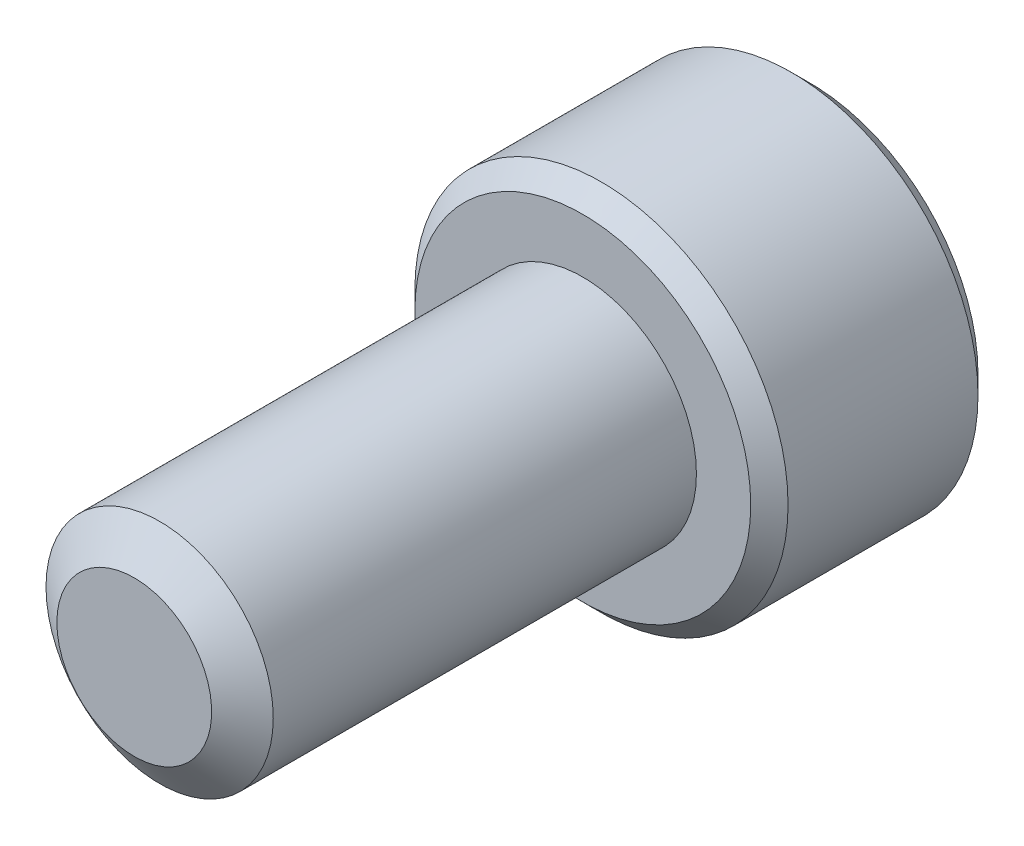
ISO-10303-21;
HEADER;
FILE_DESCRIPTION(('STEP AP214'),'2;1');
FILE_NAME('part.step','',(''),(''),'','','');
FILE_SCHEMA(('AUTOMOTIVE_DESIGN { 1 0 10303 214 1 1 1 1 }'));
ENDSEC;
DATA;
#1=APPLICATION_CONTEXT('core data for automotive mechanical design processes');
#2=APPLICATION_PROTOCOL_DEFINITION('international standard','automotive_design',2000,#1);
#3=PRODUCT_CONTEXT('',#1,'mechanical');
#4=PRODUCT('Part','Part','',(#3));
#5=PRODUCT_RELATED_PRODUCT_CATEGORY('part','',(#4));
#6=PRODUCT_DEFINITION_FORMATION('','',#4);
#7=PRODUCT_DEFINITION_CONTEXT('part definition',#1,'design');
#8=PRODUCT_DEFINITION('design','',#6,#7);
#9=PRODUCT_DEFINITION_SHAPE('','',#8);
#10=(LENGTH_UNIT() NAMED_UNIT(*) SI_UNIT(.MILLI.,.METRE.));
#11=(NAMED_UNIT(*) PLANE_ANGLE_UNIT() SI_UNIT($,.RADIAN.));
#12=(NAMED_UNIT(*) SI_UNIT($,.STERADIAN.) SOLID_ANGLE_UNIT());
#13=UNCERTAINTY_MEASURE_WITH_UNIT(LENGTH_MEASURE(1.E-05),#10,'distance_accuracy_value','');
#14=(GEOMETRIC_REPRESENTATION_CONTEXT(3) GLOBAL_UNCERTAINTY_ASSIGNED_CONTEXT((#13)) GLOBAL_UNIT_ASSIGNED_CONTEXT((#10,
#11,#12)) REPRESENTATION_CONTEXT('',''));
#15=CARTESIAN_POINT('',(0.,0.,0.));
#16=DIRECTION('',(0.,0.,1.));
#17=DIRECTION('',(1.,0.,0.));
#18=AXIS2_PLACEMENT_3D('',#15,#16,#17);
#19=CARTESIAN_POINT('',(0.,0.,-4.826));
#20=DIRECTION('',(0.,0.,1.));
#21=DIRECTION('',(1.,0.,0.));
#22=AXIS2_PLACEMENT_3D('',#19,#20,#21);
#23=PLANE('',#22);
#24=CARTESIAN_POINT('',(0.,0.,-4.826));
#25=DIRECTION('',(0.,0.,1.));
#26=DIRECTION('',(1.,0.,0.));
#27=AXIS2_PLACEMENT_3D('',#24,#25,#26);
#28=CIRCLE('',#27,3.56616);
#29=CARTESIAN_POINT('',(3.56616,0.,-4.826));
#30=VERTEX_POINT('',#29);
#31=EDGE_CURVE('E11',#30,#30,#28,.F.);
#32=ORIENTED_EDGE('',*,*,#31,.T.);
#33=EDGE_LOOP('',(#32));
#34=FACE_BOUND('',#33,.T.);
#35=CARTESIAN_POINT('',(0.,0.,-4.826));
#36=DIRECTION('',(0.,0.,-1.));
#37=DIRECTION('',(-1.,0.,0.));
#38=AXIS2_PLACEMENT_3D('',#35,#36,#37);
#39=CIRCLE('',#38,2.29135888084633);
#40=CARTESIAN_POINT('',(1.984375,1.14567944042316,-4.826));
#41=VERTEX_POINT('',#40);
#42=CARTESIAN_POINT('',(1.984375,-1.14567944042317,-4.826));
#43=VERTEX_POINT('',#42);
#44=EDGE_CURVE('E61',#41,#43,#39,.T.);
#45=ORIENTED_EDGE('',*,*,#44,.F.);
#46=CARTESIAN_POINT('',(0.,2.29135888084633,-4.826));
#47=VERTEX_POINT('',#46);
#48=EDGE_CURVE('E143',#47,#41,#39,.T.);
#49=ORIENTED_EDGE('',*,*,#48,.F.);
#50=CARTESIAN_POINT('',(-1.984375,1.14567944042317,-4.826));
#51=VERTEX_POINT('',#50);
#52=EDGE_CURVE('E138',#51,#47,#39,.T.);
#53=ORIENTED_EDGE('',*,*,#52,.F.);
#54=CARTESIAN_POINT('',(-1.984375,-1.14567944042317,-4.826));
#55=VERTEX_POINT('',#54);
#56=EDGE_CURVE('E102',#55,#51,#39,.T.);
#57=ORIENTED_EDGE('',*,*,#56,.F.);
#58=CARTESIAN_POINT('',(0.,-2.29135888084633,-4.826));
#59=VERTEX_POINT('',#58);
#60=EDGE_CURVE('E93',#59,#55,#39,.T.);
#61=ORIENTED_EDGE('',*,*,#60,.F.);
#62=EDGE_CURVE('E54',#43,#59,#39,.T.);
#63=ORIENTED_EDGE('',*,*,#62,.F.);
#64=EDGE_LOOP('',(#45,#49,#53,#57,#61,#63));
#65=FACE_BOUND('',#64,.T.);
#66=ADVANCED_FACE('F39',(#34,#65),#23,.F.);
#67=CARTESIAN_POINT('',(0.,0.,9.525));
#68=DIRECTION('',(0.,0.,-1.));
#69=DIRECTION('',(-1.,0.,0.));
#70=AXIS2_PLACEMENT_3D('',#67,#68,#69);
#71=CYLINDRICAL_SURFACE('',#70,2.413);
#72=CARTESIAN_POINT('',(0.,0.,8.98615127117986));
#73=DIRECTION('',(0.,0.,-1.));
#74=DIRECTION('',(-1.,0.,0.));
#75=AXIS2_PLACEMENT_3D('',#72,#73,#74);
#76=CIRCLE('',#75,2.413);
#77=CARTESIAN_POINT('',(-2.413,0.,8.98615127117986));
#78=VERTEX_POINT('',#77);
#79=EDGE_CURVE('E185',#78,#78,#76,.T.);
#80=CARTESIAN_POINT('',(0.,0.,0.));
#81=DIRECTION('',(0.,0.,1.));
#82=DIRECTION('',(1.,0.,0.));
#83=AXIS2_PLACEMENT_3D('',#80,#81,#82);
#84=CIRCLE('',#83,2.413);
#85=CARTESIAN_POINT('',(-2.413,0.,0.));
#86=VERTEX_POINT('',#85);
#87=EDGE_CURVE('E184',#86,#86,#84,.T.);
#88=CARTESIAN_POINT('',(-2.413,0.,8.98615127117986));
#89=CARTESIAN_POINT('',(-2.413,0.,8.89254552877173));
#90=CARTESIAN_POINT('',(-2.413,0.,8.79893978636361));
#91=CARTESIAN_POINT('',(-2.413,0.,8.61172830154736));
#92=CARTESIAN_POINT('',(-2.413,0.,8.51812255913924));
#93=CARTESIAN_POINT('',(-2.413,0.,8.33091107432299));
#94=CARTESIAN_POINT('',(-2.413,0.,8.23730533191487));
#95=CARTESIAN_POINT('',(-2.413,0.,8.05009384709862));
#96=CARTESIAN_POINT('',(-2.413,0.,7.9564881046905));
#97=CARTESIAN_POINT('',(-2.413,0.,7.76927661987425));
#98=CARTESIAN_POINT('',(-2.413,0.,7.67567087746613));
#99=CARTESIAN_POINT('',(-2.413,0.,7.48845939264988));
#100=CARTESIAN_POINT('',(-2.413,0.,7.39485365024176));
#101=CARTESIAN_POINT('',(-2.413,0.,7.20764216542551));
#102=CARTESIAN_POINT('',(-2.413,0.,7.11403642301739));
#103=CARTESIAN_POINT('',(-2.413,0.,6.92682493820114));
#104=CARTESIAN_POINT('',(-2.413,0.,6.83321919579302));
#105=CARTESIAN_POINT('',(-2.413,0.,6.64600771097677));
#106=CARTESIAN_POINT('',(-2.413,0.,6.55240196856865));
#107=CARTESIAN_POINT('',(-2.413,0.,6.3651904837524));
#108=CARTESIAN_POINT('',(-2.413,0.,6.27158474134428));
#109=CARTESIAN_POINT('',(-2.413,0.,6.08437325652803));
#110=CARTESIAN_POINT('',(-2.413,0.,5.9907675141199));
#111=CARTESIAN_POINT('',(-2.413,0.,5.80355602930366));
#112=CARTESIAN_POINT('',(-2.413,0.,5.70995028689553));
#113=CARTESIAN_POINT('',(-2.413,0.,5.52273880207929));
#114=CARTESIAN_POINT('',(-2.413,0.,5.42913305967117));
#115=CARTESIAN_POINT('',(-2.413,0.,5.24192157485492));
#116=CARTESIAN_POINT('',(-2.413,0.,5.14831583244679));
#117=CARTESIAN_POINT('',(-2.413,0.,4.96110434763055));
#118=CARTESIAN_POINT('',(-2.413,0.,4.86749860522242));
#119=CARTESIAN_POINT('',(-2.413,0.,4.68028712040618));
#120=CARTESIAN_POINT('',(-2.413,0.,4.58668137799805));
#121=CARTESIAN_POINT('',(-2.413,0.,4.3994698931818));
#122=CARTESIAN_POINT('',(-2.413,0.,4.30586415077368));
#123=CARTESIAN_POINT('',(-2.413,0.,4.11865266595743));
#124=CARTESIAN_POINT('',(-2.413,0.,4.02504692354931));
#125=CARTESIAN_POINT('',(-2.413,0.,3.83783543873306));
#126=CARTESIAN_POINT('',(-2.413,0.,3.74422969632494));
#127=CARTESIAN_POINT('',(-2.413,0.,3.55701821150869));
#128=CARTESIAN_POINT('',(-2.413,0.,3.46341246910057));
#129=CARTESIAN_POINT('',(-2.413,0.,3.27620098428432));
#130=CARTESIAN_POINT('',(-2.413,0.,3.1825952418762));
#131=CARTESIAN_POINT('',(-2.413,0.,2.99538375705995));
#132=CARTESIAN_POINT('',(-2.413,0.,2.90177801465183));
#133=CARTESIAN_POINT('',(-2.413,0.,2.71456652983558));
#134=CARTESIAN_POINT('',(-2.413,0.,2.62096078742746));
#135=CARTESIAN_POINT('',(-2.413,0.,2.43374930261121));
#136=CARTESIAN_POINT('',(-2.413,0.,2.34014356020309));
#137=CARTESIAN_POINT('',(-2.413,0.,2.15293207538684));
#138=CARTESIAN_POINT('',(-2.413,0.,2.05932633297872));
#139=CARTESIAN_POINT('',(-2.413,0.,1.87211484816247));
#140=CARTESIAN_POINT('',(-2.413,0.,1.77850910575435));
#141=CARTESIAN_POINT('',(-2.413,0.,1.5912976209381));
#142=CARTESIAN_POINT('',(-2.413,0.,1.49769187852998));
#143=CARTESIAN_POINT('',(-2.413,0.,1.31048039371373));
#144=CARTESIAN_POINT('',(-2.413,0.,1.21687465130561));
#145=CARTESIAN_POINT('',(-2.413,0.,1.02966316648936));
#146=CARTESIAN_POINT('',(-2.413,0.,0.936057424081235));
#147=CARTESIAN_POINT('',(-2.413,0.,0.748845939264988));
#148=CARTESIAN_POINT('',(-2.413,0.,0.655240196856864));
#149=CARTESIAN_POINT('',(-2.413,0.,0.468028712040617));
#150=CARTESIAN_POINT('',(-2.413,0.,0.374422969632494));
#151=CARTESIAN_POINT('',(-2.413,0.,0.187211484816247));
#152=CARTESIAN_POINT('',(-2.413,0.,0.0936057424081236));
#153=CARTESIAN_POINT('',(-2.413,0.,0.));
#154=B_SPLINE_CURVE_WITH_KNOTS('',3,(#88,#89,#90,#91,#92,#93,#94,#95,#96,#97,#98,#99,#100,#101,
#102,#103,#104,#105,#106,#107,#108,#109,#110,#111,#112,#113,#114,#115,#116,#117,#118,#119,#120,
#121,#122,#123,#124,#125,#126,#127,#128,#129,#130,#131,#132,#133,#134,#135,#136,#137,#138,#139,
#140,#141,#142,#143,#144,#145,#146,#147,#148,#149,#150,#151,#152,#153),.UNSPECIFIED.,.F.,.F.,(4,
2,2,2,2,2,2,2,2,2,2,2,2,2,2,2,2,2,2,2,2,2,2,2,2,2,2,2,2,2,2,2,4),(0.,0.280817227224372,
0.561634454448743,0.842451681673113,1.12326890889748,1.40408613612185,1.68490336334622,
1.96572059057059,2.24653781779497,2.52735504501934,2.80817227224371,3.08898949946808,
3.36980672669245,3.65062395391682,3.93144118114119,4.21225840836556,4.49307563558993,
4.7738928628143,5.05471009003867,5.33552731726304,5.61634454448741,5.89716177171178,
6.17797899893615,6.45879622616053,6.7396134533849,7.02043068060927,7.30124790783364,
7.58206513505801,7.86288236228238,8.14369958950675,8.42451681673112,8.70533404395549,
8.98615127117986),.UNSPECIFIED.);
#155=EDGE_CURVE('BSEAM255',#78,#86,#154,.T.);
#156=ORIENTED_EDGE('',*,*,#79,.T.);
#157=ORIENTED_EDGE('',*,*,#87,.T.);
#158=ORIENTED_EDGE('',*,*,#155,.T.);
#159=ORIENTED_EDGE('',*,*,#155,.F.);
#160=EDGE_LOOP('',(#156,#158,#157,#159));
#161=FACE_BOUND('',#160,.T.);
#162=ADVANCED_FACE('F255',(#161),#71,.T.);
#163=CARTESIAN_POINT('',(0.,0.,9.52500000000001));
#164=DIRECTION('',(0.,0.,-1.));
#165=DIRECTION('',(-1.,0.,0.));
#166=AXIS2_PLACEMENT_3D('',#163,#164,#165);
#167=CONICAL_SURFACE('',#166,1.643444262,0.959931088596871);
#168=ORIENTED_EDGE('',*,*,#79,.F.);
#169=EDGE_LOOP('',(#168));
#170=FACE_BOUND('',#169,.T.);
#171=CARTESIAN_POINT('',(0.,0.,9.52500000000001));
#172=DIRECTION('',(0.,0.,-1.));
#173=DIRECTION('',(-1.,0.,0.));
#174=AXIS2_PLACEMENT_3D('',#171,#172,#173);
#175=CIRCLE('',#174,1.643444262);
#176=CARTESIAN_POINT('',(-1.643444262,0.,9.52500000000001));
#177=VERTEX_POINT('',#176);
#178=EDGE_CURVE('E115',#177,#177,#175,.T.);
#179=ORIENTED_EDGE('',*,*,#178,.T.);
#180=EDGE_LOOP('',(#179));
#181=FACE_BOUND('',#180,.T.);
#182=ADVANCED_FACE('F265',(#170,#181),#167,.T.);
#183=CARTESIAN_POINT('',(0.,0.,9.525));
#184=DIRECTION('',(0.,0.,1.));
#185=DIRECTION('',(1.,0.,0.));
#186=AXIS2_PLACEMENT_3D('',#183,#184,#185);
#187=PLANE('',#186);
#188=ORIENTED_EDGE('',*,*,#178,.F.);
#189=EDGE_LOOP('',(#188));
#190=FACE_BOUND('',#189,.T.);
#191=ADVANCED_FACE('F263',(#190),#187,.T.);
#192=CARTESIAN_POINT('',(0.,0.,-4.826));
#193=DIRECTION('',(0.,0.,1.));
#194=DIRECTION('',(1.,0.,0.));
#195=AXIS2_PLACEMENT_3D('',#192,#193,#194);
#196=CYLINDRICAL_SURFACE('',#195,3.9624);
#197=CARTESIAN_POINT('',(0.,0.,-0.396240000000001));
#198=DIRECTION('',(0.,0.,1.));
#199=DIRECTION('',(1.,0.,0.));
#200=AXIS2_PLACEMENT_3D('',#197,#198,#199);
#201=CIRCLE('',#200,3.9624);
#202=CARTESIAN_POINT('',(3.9624,0.,-0.396240000000001));
#203=VERTEX_POINT('',#202);
#204=EDGE_CURVE('E48',#203,#203,#201,.F.);
#205=ORIENTED_EDGE('',*,*,#204,.T.);
#206=EDGE_LOOP('',(#205));
#207=FACE_BOUND('',#206,.T.);
#208=CARTESIAN_POINT('',(0.,0.,-4.42976));
#209=DIRECTION('',(0.,0.,1.));
#210=DIRECTION('',(1.,0.,0.));
#211=AXIS2_PLACEMENT_3D('',#208,#209,#210);
#212=CIRCLE('',#211,3.9624);
#213=CARTESIAN_POINT('',(3.9624,0.,-4.42976));
#214=VERTEX_POINT('',#213);
#215=EDGE_CURVE('E286',#214,#214,#212,.T.);
#216=ORIENTED_EDGE('',*,*,#215,.T.);
#217=EDGE_LOOP('',(#216));
#218=FACE_BOUND('',#217,.T.);
#219=ADVANCED_FACE('F259',(#207,#218),#196,.T.);
#220=CARTESIAN_POINT('',(0.,0.,0.));
#221=DIRECTION('',(0.,0.,1.));
#222=DIRECTION('',(1.,0.,0.));
#223=AXIS2_PLACEMENT_3D('',#220,#221,#222);
#224=PLANE('',#223);
#225=CARTESIAN_POINT('',(0.,0.,0.));
#226=DIRECTION('',(0.,0.,1.));
#227=DIRECTION('',(1.,0.,0.));
#228=AXIS2_PLACEMENT_3D('',#225,#226,#227);
#229=CIRCLE('',#228,3.56616);
#230=CARTESIAN_POINT('',(3.56616,0.,0.));
#231=VERTEX_POINT('',#230);
#232=EDGE_CURVE('E114',#231,#231,#229,.T.);
#233=ORIENTED_EDGE('',*,*,#232,.T.);
#234=EDGE_LOOP('',(#233));
#235=FACE_BOUND('',#234,.T.);
#236=ORIENTED_EDGE('',*,*,#87,.F.);
#237=EDGE_LOOP('',(#236));
#238=FACE_BOUND('',#237,.T.);
#239=ADVANCED_FACE('F208',(#235,#238),#224,.T.);
#240=CARTESIAN_POINT('',(0.,0.,-4.826));
#241=DIRECTION('',(0.,0.,-1.));
#242=DIRECTION('',(-1.,0.,0.));
#243=AXIS2_PLACEMENT_3D('',#240,#241,#242);
#244=CONICAL_SURFACE('',#243,2.29135888084633,0.78539816339745);
#245=CARTESIAN_POINT('',(-1.984375,4.38635024598007,-7.34897519782274));
#246=CARTESIAN_POINT('',(-1.984375,4.25778236916222,-7.23187255043514));
#247=CARTESIAN_POINT('',(-1.984375,4.12880938963501,-7.1152075711675));
#248=CARTESIAN_POINT('',(-1.984375,3.8697150482739,-6.88309307113962));
#249=CARTESIAN_POINT('',(-1.984375,3.73959339744263,-6.76764387326629));
#250=CARTESIAN_POINT('',(-1.984375,3.47693738702936,-6.53749248847528));
#251=CARTESIAN_POINT('',(-1.984375,3.3443922128216,-6.42280261206569));
#252=CARTESIAN_POINT('',(-1.984375,3.07740414215957,-6.19568123842686));
#253=CARTESIAN_POINT('',(-1.984375,2.94296150861167,-6.08324943345639));
#254=CARTESIAN_POINT('',(-1.984375,2.69093433000247,-5.87745000368473));
#255=CARTESIAN_POINT('',(-1.984375,2.57369587574335,-5.78365991859573));
#256=CARTESIAN_POINT('',(-1.984375,2.33669402095219,-5.59933006518558));
#257=CARTESIAN_POINT('',(-1.984375,2.21693090511933,-5.5087899334554));
#258=CARTESIAN_POINT('',(-1.984375,1.97414978626332,-5.33250529335592));
#259=CARTESIAN_POINT('',(-1.984375,1.8511363783479,-5.24675449786087));
#260=CARTESIAN_POINT('',(-1.984375,1.60051911268812,-5.08227129509849));
#261=CARTESIAN_POINT('',(-1.984375,1.47291846186661,-5.00353411359307));
#262=CARTESIAN_POINT('',(-1.984375,1.2789090002779,-4.89486132815752));
#263=CARTESIAN_POINT('',(-1.984375,1.21488472401634,-4.86070149112759));
#264=CARTESIAN_POINT('',(-1.984375,1.08519642932975,-4.79566586392286));
#265=CARTESIAN_POINT('',(-1.984375,1.01953210237452,-4.76479069750205));
#266=CARTESIAN_POINT('',(-1.984375,0.81999148678731,-4.67842375900681));
#267=CARTESIAN_POINT('',(-1.984375,0.683245753728957,-4.62900101211804));
#268=CARTESIAN_POINT('',(-1.984375,0.48625684861587,-4.5769842359019));
#269=CARTESIAN_POINT('',(-1.984375,0.428714400653208,-4.56399752017917));
#270=CARTESIAN_POINT('',(-1.984375,0.312779003368322,-4.5427082809321));
#271=CARTESIAN_POINT('',(-1.984375,0.254386491647091,-4.53440342902996));
#272=CARTESIAN_POINT('',(-1.984375,0.137202439336304,-4.52290067704976));
#273=CARTESIAN_POINT('',(-1.984375,0.0784118196893296,-4.51969349911655));
#274=CARTESIAN_POINT('',(-1.984375,-0.0392233767990006,-4.51853221278239));
#275=CARTESIAN_POINT('',(-1.984375,-0.0980679542441397,-4.52057816389864));
#276=CARTESIAN_POINT('',(-1.984375,-0.21520013647359,-4.52979857799852));
#277=CARTESIAN_POINT('',(-1.984375,-0.273488761914176,-4.53696028481731));
#278=CARTESIAN_POINT('',(-1.984375,-0.389286265316371,-4.55603259141478));
#279=CARTESIAN_POINT('',(-1.984375,-0.446794960098088,-4.567944287499));
#280=CARTESIAN_POINT('',(-1.984375,-0.56091102362673,-4.59602327187489));
#281=CARTESIAN_POINT('',(-1.984375,-0.61751563591901,-4.61220162881068));
#282=CARTESIAN_POINT('',(-1.984375,-0.729535693290378,-4.64820502249007));
#283=CARTESIAN_POINT('',(-1.984375,-0.784951198991555,-4.66802987283546));
#284=CARTESIAN_POINT('',(-1.984375,-0.914325334864688,-4.7184487048077));
#285=CARTESIAN_POINT('',(-1.984375,-0.987772757857292,-4.7503494712672));
#286=CARTESIAN_POINT('',(-1.984375,-1.13259042621503,-4.81859015311983));
#287=CARTESIAN_POINT('',(-1.984375,-1.20395954857947,-4.85493241529602));
#288=CARTESIAN_POINT('',(-1.984375,-1.34496189830389,-4.93112595582489));
#289=CARTESIAN_POINT('',(-1.984375,-1.41459154292871,-4.97098381524999));
#290=CARTESIAN_POINT('',(-1.984375,-1.55223895461487,-5.05340283838906));
#291=CARTESIAN_POINT('',(-1.984375,-1.62025639194186,-5.09596454866417));
#292=CARTESIAN_POINT('',(-1.984375,-1.823662914216,-5.22772004019455));
#293=CARTESIAN_POINT('',(-1.984375,-1.95694317622707,-5.32016210087376));
#294=CARTESIAN_POINT('',(-1.984375,-2.21933064334271,-5.51039077948145));
#295=CARTESIAN_POINT('',(-1.984375,-2.34844239081737,-5.60817124432184));
#296=CARTESIAN_POINT('',(-1.984375,-2.64424712607428,-5.83898376478607));
#297=CARTESIAN_POINT('',(-1.984375,-2.80988215135694,-5.97336658258107));
#298=CARTESIAN_POINT('',(-1.984375,-3.13786393939787,-6.24620657210738));
#299=CARTESIAN_POINT('',(-1.984375,-3.30020907072943,-6.38466568561171));
#300=CARTESIAN_POINT('',(-1.984375,-3.61743160532523,-6.65987341299285));
#301=CARTESIAN_POINT('',(-1.984375,-3.77238267778691,-6.79653731694909));
#302=CARTESIAN_POINT('',(-1.984375,-4.00353093931969,-7.00284090592041));
#303=CARTESIAN_POINT('',(-1.984375,-4.08033809401079,-7.0718000308107));
#304=CARTESIAN_POINT('',(-1.984375,-4.23359721811938,-7.21010924523581));
#305=CARTESIAN_POINT('',(-1.984375,-4.31004919377067,-7.27945932786121));
#306=CARTESIAN_POINT('',(-1.984375,-4.38635024598007,-7.34897519782274));
#307=B_SPLINE_CURVE_WITH_KNOTS('',3,(#245,#246,#247,#248,#249,#250,#251,#252,#253,#254,#255,
#256,#257,#258,#259,#260,#261,#262,#263,#264,#265,#266,#267,#268,#269,#270,#271,#272,#273,#274,
#275,#276,#277,#278,#279,#280,#281,#282,#283,#284,#285,#286,#287,#288,#289,#290,#291,#292,#293,
#294,#295,#296,#297,#298,#299,#300,#301,#302,#303,#304,#305,#306),.UNSPECIFIED.,.F.,.F.,(4,2,2,
2,2,2,2,2,2,2,2,2,2,2,2,2,2,2,2,2,2,2,2,2,2,2,2,2,2,2,4),(0.,0.521719337468404,1.04357390539815,
1.56938723748946,2.09512841606326,2.54550444646996,2.99582995804647,3.44554970250013,
3.89496094065995,4.11257110412757,4.33022251794828,4.76440966817832,4.94122399976167,
5.11795032054924,5.29435462654118,5.47076093117717,5.64672889434269,5.82273749473955,
5.99920726953631,6.17566802621274,6.41569497411234,6.655849299482,6.89646313424995,
7.1371257628443,7.62347501633089,8.10927507181707,8.74903978219147,9.38911434398421,
10.0089169746635,10.3185808917335,10.6282393531493),.UNSPECIFIED.);
#308=EDGE_CURVE('E107',#51,#55,#307,.T.);
#309=ORIENTED_EDGE('',*,*,#308,.T.);
#310=ORIENTED_EDGE('',*,*,#56,.T.);
#311=EDGE_LOOP('',(#309,#310));
#312=FACE_BOUND('',#311,.T.);
#313=ADVANCED_FACE('F108',(#312),#244,.F.);
#314=CARTESIAN_POINT('',(0.000199999999999783,2.29147435090017,-4.82611547878184));
#315=CARTESIAN_POINT('',(-0.0680159951668025,2.25208982772758,-4.78676285226391));
#316=CARTESIAN_POINT('',(-0.137372685106966,2.21204672412052,-4.74972131044618));
#317=CARTESIAN_POINT('',(-0.278798800452188,2.13039431835551,-4.68189885842332));
#318=CARTESIAN_POINT('',(-0.350881678736783,2.08877724917394,-4.65115568909175));
#319=CARTESIAN_POINT('',(-0.496233397266004,2.00485839535392,-4.59849188881121));
#320=CARTESIAN_POINT('',(-0.569465212486939,1.96257798712287,-4.57643887587996));
#321=CARTESIAN_POINT('',(-0.717541182594706,1.87708628592063,-4.54246149294388));
#322=CARTESIAN_POINT('',(-0.792380812753425,1.83387760530244,-4.53051175609173));
#323=CARTESIAN_POINT('',(-0.921360414543816,1.75941119748879,-4.5197300990819));
#324=CARTESIAN_POINT('',(-0.975333715772442,1.72824969749539,-4.51813389905907));
#325=CARTESIAN_POINT('',(-1.0831921185198,1.66597761963484,-4.52082183886529));
#326=CARTESIAN_POINT('',(-1.13707718248552,1.63486706344893,-4.52510804034046));
#327=CARTESIAN_POINT('',(-1.2443385382486,1.57293969082547,-4.53931687301352));
#328=CARTESIAN_POINT('',(-1.29771419276014,1.54212324232506,-4.54924581045227));
#329=CARTESIAN_POINT('',(-1.4035425174089,1.48102323060122,-4.57419508427454));
#330=CARTESIAN_POINT('',(-1.4559952579711,1.45073962671789,-4.58921503038949));
#331=CARTESIAN_POINT('',(-1.59035733896365,1.37316564308797,-4.63380785163567));
#332=CARTESIAN_POINT('',(-1.67143335715833,1.32635638215845,-4.66674299593833));
#333=CARTESIAN_POINT('',(-1.79064830672984,1.25752759893191,-4.7223424412022));
#334=CARTESIAN_POINT('',(-1.829934924386,1.23484545965257,-4.74187759205186));
#335=CARTESIAN_POINT('',(-1.90778036186805,1.18990137536713,-4.7827287381194));
#336=CARTESIAN_POINT('',(-1.9463396111017,1.16763918244233,-4.80404363956835));
#337=CARTESIAN_POINT('',(-1.984575,1.14556397036933,-4.82611547878184));
#338=B_SPLINE_CURVE_WITH_KNOTS('',3,(#314,#315,#316,#317,#318,#319,#320,#321,#322,#323,#324,
#325,#326,#327,#328,#329,#330,#331,#332,#333,#334,#335,#336,#337),.UNSPECIFIED.,.F.,.F.,(4,2,2,
2,2,2,2,2,2,2,2,4),(0.,0.264339630306626,0.530219665093694,0.79187641637146,1.05287424418109,
1.239639843932,1.42647091743852,1.61351120244035,1.8005371524754,2.09764209964316,
2.24579179873714,2.39385111134157),.UNSPECIFIED.);
#339=EDGE_CURVE('E142',#47,#51,#338,.T.);
#340=ORIENTED_EDGE('',*,*,#339,.T.);
#341=ORIENTED_EDGE('',*,*,#52,.T.);
#342=EDGE_LOOP('',(#340,#341));
#343=FACE_BOUND('',#342,.T.);
#344=ADVANCED_FACE('F207',(#343),#244,.F.);
#345=CARTESIAN_POINT('',(1.984575,1.14556397036933,-4.82611547878184));
#346=CARTESIAN_POINT('',(1.9163590048332,1.18494849354192,-4.78676285226391));
#347=CARTESIAN_POINT('',(1.84700231489303,1.22499159714897,-4.74972131044618));
#348=CARTESIAN_POINT('',(1.70557619954781,1.30664400291398,-4.68189885842332));
#349=CARTESIAN_POINT('',(1.63349332126322,1.34826107209555,-4.65115568909175));
#350=CARTESIAN_POINT('',(1.488141602734,1.43217992591557,-4.59849188881121));
#351=CARTESIAN_POINT('',(1.41490978751306,1.47446033414663,-4.57643887587996));
#352=CARTESIAN_POINT('',(1.26683381740529,1.55995203534886,-4.54246149294388));
#353=CARTESIAN_POINT('',(1.19199418724658,1.60316071596705,-4.53051175609173));
#354=CARTESIAN_POINT('',(1.06301458545619,1.6776271237807,-4.5197300990819));
#355=CARTESIAN_POINT('',(1.00904128422756,1.7087886237741,-4.51813389905907));
#356=CARTESIAN_POINT('',(0.901182881480201,1.77106070163465,-4.52082183886529));
#357=CARTESIAN_POINT('',(0.847297817514478,1.80217125782056,-4.52510804034046));
#358=CARTESIAN_POINT('',(0.740036461751397,1.86409863044402,-4.53931687301352));
#359=CARTESIAN_POINT('',(0.686660807239861,1.89491507894443,-4.54924581045227));
#360=CARTESIAN_POINT('',(0.580832482591104,1.95601509066828,-4.57419508427454));
#361=CARTESIAN_POINT('',(0.528379742028899,1.9862986945516,-4.58921503038949));
#362=CARTESIAN_POINT('',(0.394017661036352,2.06387267818152,-4.63380785163567));
#363=CARTESIAN_POINT('',(0.312941642841677,2.11068193911104,-4.66674299593833));
#364=CARTESIAN_POINT('',(0.193726693270161,2.17951072233758,-4.7223424412022));
#365=CARTESIAN_POINT('',(0.154440075614,2.20219286161692,-4.74187759205186));
#366=CARTESIAN_POINT('',(0.0765946381319476,2.24713694590237,-4.7827287381194));
#367=CARTESIAN_POINT('',(0.0380353888983018,2.26939913882716,-4.80404363956835));
#368=CARTESIAN_POINT('',(-0.000199999999999806,2.29147435090017,-4.82611547878184));
#369=B_SPLINE_CURVE_WITH_KNOTS('',3,(#345,#346,#347,#348,#349,#350,#351,#352,#353,#354,#355,
#356,#357,#358,#359,#360,#361,#362,#363,#364,#365,#366,#367,#368),.UNSPECIFIED.,.F.,.F.,(4,2,2,
2,2,2,2,2,2,2,2,4),(0.,0.264339630306626,0.530219665093694,0.791876416371459,1.05287424418109,
1.239639843932,1.42647091743852,1.61351120244035,1.8005371524754,2.09764209964316,
2.24579179873714,2.39385111134157),.UNSPECIFIED.);
#370=EDGE_CURVE('E148',#41,#47,#369,.T.);
#371=ORIENTED_EDGE('',*,*,#370,.T.);
#372=ORIENTED_EDGE('',*,*,#48,.T.);
#373=EDGE_LOOP('',(#371,#372));
#374=FACE_BOUND('',#373,.T.);
#375=ADVANCED_FACE('F153',(#374),#244,.F.);
#376=CARTESIAN_POINT('',(1.984375,-4.38635024598007,-7.34897519782274));
#377=CARTESIAN_POINT('',(1.984375,-4.25778236916222,-7.23187255043513));
#378=CARTESIAN_POINT('',(1.984375,-4.12880938963501,-7.1152075711675));
#379=CARTESIAN_POINT('',(1.984375,-3.86971504827389,-6.88309307113962));
#380=CARTESIAN_POINT('',(1.984375,-3.73959339744262,-6.76764387326629));
#381=CARTESIAN_POINT('',(1.984375,-3.47693738702935,-6.53749248847528));
#382=CARTESIAN_POINT('',(1.984375,-3.3443922128216,-6.42280261206568));
#383=CARTESIAN_POINT('',(1.984375,-3.07740414215957,-6.19568123842686));
#384=CARTESIAN_POINT('',(1.984375,-2.94296150861167,-6.08324943345639));
#385=CARTESIAN_POINT('',(1.984375,-2.69093433000247,-5.87745000368473));
#386=CARTESIAN_POINT('',(1.984375,-2.57369587574335,-5.78365991859572));
#387=CARTESIAN_POINT('',(1.984375,-2.33669402095219,-5.59933006518558));
#388=CARTESIAN_POINT('',(1.984375,-2.21693090511933,-5.5087899334554));
#389=CARTESIAN_POINT('',(1.984375,-1.97414978626332,-5.33250529335592));
#390=CARTESIAN_POINT('',(1.984375,-1.85113637834789,-5.24675449786087));
#391=CARTESIAN_POINT('',(1.984375,-1.60051911268812,-5.08227129509849));
#392=CARTESIAN_POINT('',(1.984375,-1.47291846186661,-5.00353411359307));
#393=CARTESIAN_POINT('',(1.984375,-1.2789090002779,-4.89486132815752));
#394=CARTESIAN_POINT('',(1.984375,-1.21488472401634,-4.86070149112759));
#395=CARTESIAN_POINT('',(1.984375,-1.08519642932975,-4.79566586392286));
#396=CARTESIAN_POINT('',(1.984375,-1.01953210237452,-4.76479069750204));
#397=CARTESIAN_POINT('',(1.984375,-0.819991486787309,-4.67842375900681));
#398=CARTESIAN_POINT('',(1.984375,-0.683245753728956,-4.62900101211804));
#399=CARTESIAN_POINT('',(1.984375,-0.486256848615869,-4.5769842359019));
#400=CARTESIAN_POINT('',(1.984375,-0.428714400653207,-4.56399752017917));
#401=CARTESIAN_POINT('',(1.984375,-0.312779003368321,-4.54270828093209));
#402=CARTESIAN_POINT('',(1.984375,-0.25438649164709,-4.53440342902996));
#403=CARTESIAN_POINT('',(1.984375,-0.137202439336303,-4.52290067704976));
#404=CARTESIAN_POINT('',(1.984375,-0.0784118196893286,-4.51969349911655));
#405=CARTESIAN_POINT('',(1.984375,0.0392233767990016,-4.51853221278239));
#406=CARTESIAN_POINT('',(1.984375,0.0980679542441407,-4.52057816389864));
#407=CARTESIAN_POINT('',(1.984375,0.215200136473591,-4.52979857799852));
#408=CARTESIAN_POINT('',(1.984375,0.273488761914177,-4.53696028481731));
#409=CARTESIAN_POINT('',(1.984375,0.389286265316373,-4.55603259141478));
#410=CARTESIAN_POINT('',(1.984375,0.446794960098089,-4.567944287499));
#411=CARTESIAN_POINT('',(1.984375,0.560911023626731,-4.59602327187489));
#412=CARTESIAN_POINT('',(1.984375,0.617515635919012,-4.61220162881068));
#413=CARTESIAN_POINT('',(1.984375,0.729535693290379,-4.64820502249007));
#414=CARTESIAN_POINT('',(1.984375,0.784951198991556,-4.66802987283546));
#415=CARTESIAN_POINT('',(1.984375,0.914325334864689,-4.7184487048077));
#416=CARTESIAN_POINT('',(1.984375,0.987772757857293,-4.7503494712672));
#417=CARTESIAN_POINT('',(1.984375,1.13259042621504,-4.81859015311983));
#418=CARTESIAN_POINT('',(1.984375,1.20395954857947,-4.85493241529602));
#419=CARTESIAN_POINT('',(1.984375,1.34496189830389,-4.93112595582489));
#420=CARTESIAN_POINT('',(1.984375,1.41459154292871,-4.97098381524999));
#421=CARTESIAN_POINT('',(1.984375,1.55223895461488,-5.05340283838906));
#422=CARTESIAN_POINT('',(1.984375,1.62025639194186,-5.09596454866417));
#423=CARTESIAN_POINT('',(1.984375,1.823662914216,-5.22772004019455));
#424=CARTESIAN_POINT('',(1.984375,1.95694317622707,-5.32016210087376));
#425=CARTESIAN_POINT('',(1.984375,2.21933064334271,-5.51039077948145));
#426=CARTESIAN_POINT('',(1.984375,2.34844239081737,-5.60817124432184));
#427=CARTESIAN_POINT('',(1.984375,2.64424712607429,-5.83898376478608));
#428=CARTESIAN_POINT('',(1.984375,2.80988215135694,-5.97336658258107));
#429=CARTESIAN_POINT('',(1.984375,3.13786393939788,-6.24620657210738));
#430=CARTESIAN_POINT('',(1.984375,3.30020907072944,-6.38466568561171));
#431=CARTESIAN_POINT('',(1.984375,3.61743160532523,-6.65987341299285));
#432=CARTESIAN_POINT('',(1.984375,3.77238267778691,-6.79653731694909));
#433=CARTESIAN_POINT('',(1.984375,4.00353093931969,-7.00284090592041));
#434=CARTESIAN_POINT('',(1.984375,4.08033809401079,-7.0718000308107));
#435=CARTESIAN_POINT('',(1.984375,4.23359721811938,-7.21010924523581));
#436=CARTESIAN_POINT('',(1.984375,4.31004919377067,-7.27945932786121));
#437=CARTESIAN_POINT('',(1.984375,4.38635024598007,-7.34897519782274));
#438=B_SPLINE_CURVE_WITH_KNOTS('',3,(#376,#377,#378,#379,#380,#381,#382,#383,#384,#385,#386,
#387,#388,#389,#390,#391,#392,#393,#394,#395,#396,#397,#398,#399,#400,#401,#402,#403,#404,#405,
#406,#407,#408,#409,#410,#411,#412,#413,#414,#415,#416,#417,#418,#419,#420,#421,#422,#423,#424,
#425,#426,#427,#428,#429,#430,#431,#432,#433,#434,#435,#436,#437),.UNSPECIFIED.,.F.,.F.,(4,2,2,
2,2,2,2,2,2,2,2,2,2,2,2,2,2,2,2,2,2,2,2,2,2,2,2,2,2,2,4),(0.,0.521719337468404,1.04357390539815,
1.56938723748946,2.09512841606326,2.54550444646996,2.99582995804647,3.44554970250013,
3.89496094065995,4.11257110412757,4.33022251794828,4.76440966817832,4.94122399976167,
5.11795032054924,5.29435462654118,5.47076093117717,5.64672889434269,5.82273749473954,
5.99920726953631,6.17566802621274,6.41569497411234,6.655849299482,6.89646313424995,
7.13712576284429,7.62347501633089,8.10927507181707,8.74903978219147,9.38911434398421,
10.0089169746635,10.3185808917335,10.6282393531493),.UNSPECIFIED.);
#439=EDGE_CURVE('E160',#43,#41,#438,.T.);
#440=ORIENTED_EDGE('',*,*,#439,.T.);
#441=ORIENTED_EDGE('',*,*,#44,.T.);
#442=EDGE_LOOP('',(#440,#441));
#443=FACE_BOUND('',#442,.T.);
#444=ADVANCED_FACE('F382',(#443),#244,.F.);
#445=CARTESIAN_POINT('',(-0.000200000000000217,-2.29147435090017,-4.82611547878184));
#446=CARTESIAN_POINT('',(0.0680159951668023,-2.25208982772757,-4.78676285226391));
#447=CARTESIAN_POINT('',(0.137372685106966,-2.21204672412052,-4.74972131044618));
#448=CARTESIAN_POINT('',(0.278798800452187,-2.13039431835551,-4.68189885842332));
#449=CARTESIAN_POINT('',(0.350881678736782,-2.08877724917394,-4.65115568909175));
#450=CARTESIAN_POINT('',(0.496233397266004,-2.00485839535392,-4.59849188881121));
#451=CARTESIAN_POINT('',(0.569465212486938,-1.96257798712287,-4.57643887587996));
#452=CARTESIAN_POINT('',(0.717541182594706,-1.87708628592063,-4.54246149294387));
#453=CARTESIAN_POINT('',(0.792380812753424,-1.83387760530244,-4.53051175609173));
#454=CARTESIAN_POINT('',(0.921360414543815,-1.75941119748879,-4.5197300990819));
#455=CARTESIAN_POINT('',(0.975333715772442,-1.72824969749539,-4.51813389905907));
#456=CARTESIAN_POINT('',(1.0831921185198,-1.66597761963484,-4.52082183886529));
#457=CARTESIAN_POINT('',(1.13707718248552,-1.63486706344893,-4.52510804034046));
#458=CARTESIAN_POINT('',(1.2443385382486,-1.57293969082547,-4.53931687301352));
#459=CARTESIAN_POINT('',(1.29771419276014,-1.54212324232506,-4.54924581045227));
#460=CARTESIAN_POINT('',(1.4035425174089,-1.48102323060122,-4.57419508427454));
#461=CARTESIAN_POINT('',(1.4559952579711,-1.45073962671789,-4.58921503038949));
#462=CARTESIAN_POINT('',(1.59035733896365,-1.37316564308797,-4.63380785163567));
#463=CARTESIAN_POINT('',(1.67143335715832,-1.32635638215845,-4.66674299593833));
#464=CARTESIAN_POINT('',(1.79064830672984,-1.25752759893191,-4.7223424412022));
#465=CARTESIAN_POINT('',(1.829934924386,-1.23484545965257,-4.74187759205186));
#466=CARTESIAN_POINT('',(1.90778036186805,-1.18990137536712,-4.7827287381194));
#467=CARTESIAN_POINT('',(1.9463396111017,-1.16763918244233,-4.80404363956835));
#468=CARTESIAN_POINT('',(1.984575,-1.14556397036933,-4.82611547878184));
#469=B_SPLINE_CURVE_WITH_KNOTS('',3,(#445,#446,#447,#448,#449,#450,#451,#452,#453,#454,#455,
#456,#457,#458,#459,#460,#461,#462,#463,#464,#465,#466,#467,#468),.UNSPECIFIED.,.F.,.F.,(4,2,2,
2,2,2,2,2,2,2,2,4),(0.,0.264339630306626,0.530219665093694,0.79187641637146,1.05287424418109,
1.239639843932,1.42647091743852,1.61351120244035,1.8005371524754,2.09764209964316,
2.24579179873714,2.39385111134157),.UNSPECIFIED.);
#470=EDGE_CURVE('E128',#59,#43,#469,.T.);
#471=ORIENTED_EDGE('',*,*,#470,.T.);
#472=ORIENTED_EDGE('',*,*,#62,.T.);
#473=EDGE_LOOP('',(#471,#472));
#474=FACE_BOUND('',#473,.T.);
#475=ADVANCED_FACE('F374',(#474),#244,.F.);
#476=CARTESIAN_POINT('',(-1.984575,-1.14556397036933,-4.82611547878184));
#477=CARTESIAN_POINT('',(-1.9163590048332,-1.18494849354192,-4.78676285226391));
#478=CARTESIAN_POINT('',(-1.84700231489303,-1.22499159714897,-4.74972131044618));
#479=CARTESIAN_POINT('',(-1.70557619954781,-1.30664400291398,-4.68189885842332));
#480=CARTESIAN_POINT('',(-1.63349332126322,-1.34826107209555,-4.65115568909175));
#481=CARTESIAN_POINT('',(-1.488141602734,-1.43217992591557,-4.59849188881121));
#482=CARTESIAN_POINT('',(-1.41490978751306,-1.47446033414662,-4.57643887587996));
#483=CARTESIAN_POINT('',(-1.2668338174053,-1.55995203534886,-4.54246149294387));
#484=CARTESIAN_POINT('',(-1.19199418724658,-1.60316071596705,-4.53051175609173));
#485=CARTESIAN_POINT('',(-1.06301458545619,-1.6776271237807,-4.5197300990819));
#486=CARTESIAN_POINT('',(-1.00904128422756,-1.7087886237741,-4.51813389905907));
#487=CARTESIAN_POINT('',(-0.901182881480201,-1.77106070163465,-4.52082183886529));
#488=CARTESIAN_POINT('',(-0.847297817514478,-1.80217125782056,-4.52510804034046));
#489=CARTESIAN_POINT('',(-0.740036461751398,-1.86409863044402,-4.53931687301352));
#490=CARTESIAN_POINT('',(-0.686660807239861,-1.89491507894443,-4.54924581045227));
#491=CARTESIAN_POINT('',(-0.580832482591105,-1.95601509066827,-4.57419508427454));
#492=CARTESIAN_POINT('',(-0.5283797420289,-1.9862986945516,-4.58921503038949));
#493=CARTESIAN_POINT('',(-0.394017661036353,-2.06387267818152,-4.63380785163567));
#494=CARTESIAN_POINT('',(-0.312941642841677,-2.11068193911104,-4.66674299593833));
#495=CARTESIAN_POINT('',(-0.193726693270162,-2.17951072233758,-4.7223424412022));
#496=CARTESIAN_POINT('',(-0.154440075614,-2.20219286161692,-4.74187759205186));
#497=CARTESIAN_POINT('',(-0.0765946381319478,-2.24713694590237,-4.7827287381194));
#498=CARTESIAN_POINT('',(-0.0380353888983019,-2.26939913882716,-4.80404363956835));
#499=CARTESIAN_POINT('',(0.000199999999999776,-2.29147435090017,-4.82611547878184));
#500=B_SPLINE_CURVE_WITH_KNOTS('',3,(#476,#477,#478,#479,#480,#481,#482,#483,#484,#485,#486,
#487,#488,#489,#490,#491,#492,#493,#494,#495,#496,#497,#498,#499),.UNSPECIFIED.,.F.,.F.,(4,2,2,
2,2,2,2,2,2,2,2,4),(0.,0.264339630306626,0.530219665093693,0.791876416371459,1.05287424418109,
1.239639843932,1.42647091743852,1.61351120244034,1.8005371524754,2.09764209964316,
2.24579179873714,2.39385111134157),.UNSPECIFIED.);
#501=EDGE_CURVE('E97',#55,#59,#500,.T.);
#502=ORIENTED_EDGE('',*,*,#501,.T.);
#503=ORIENTED_EDGE('',*,*,#60,.T.);
#504=EDGE_LOOP('',(#502,#503));
#505=FACE_BOUND('',#504,.T.);
#506=ADVANCED_FACE('F95',(#505),#244,.F.);
#507=CARTESIAN_POINT('',(0.,0.,-1.8494375));
#508=DIRECTION('',(0.,0.,1.));
#509=DIRECTION('',(1.,0.,0.));
#510=AXIS2_PLACEMENT_3D('',#507,#508,#509);
#511=PLANE('',#510);
#512=DIRECTION('',(0.866025403784439,-0.5,0.));
#513=VECTOR('',#512,1.);
#514=CARTESIAN_POINT('',(-0.9921875,-1.71851916063475,-1.8494375));
#515=LINE('',#514,#513);
#516=CARTESIAN_POINT('',(-1.984375,-1.14567944042316,-1.8494375));
#517=VERTEX_POINT('',#516);
#518=CARTESIAN_POINT('',(0.,-2.29135888084633,-1.8494375));
#519=VERTEX_POINT('',#518);
#520=EDGE_CURVE('E127',#517,#519,#515,.T.);
#521=ORIENTED_EDGE('',*,*,#520,.F.);
#522=DIRECTION('',(0.,-1.,0.));
#523=VECTOR('',#522,1.);
#524=CARTESIAN_POINT('',(-1.984375,0.,-1.8494375));
#525=LINE('',#524,#523);
#526=CARTESIAN_POINT('',(-1.984375,1.14567944042316,-1.8494375));
#527=VERTEX_POINT('',#526);
#528=EDGE_CURVE('E132',#527,#517,#525,.T.);
#529=ORIENTED_EDGE('',*,*,#528,.F.);
#530=DIRECTION('',(-0.866025403784439,-0.5,0.));
#531=VECTOR('',#530,1.);
#532=CARTESIAN_POINT('',(-0.992187500000001,1.71851916063475,-1.8494375));
#533=LINE('',#532,#531);
#534=CARTESIAN_POINT('',(0.,2.29135888084633,-1.8494375));
#535=VERTEX_POINT('',#534);
#536=EDGE_CURVE('E446',#535,#527,#533,.T.);
#537=ORIENTED_EDGE('',*,*,#536,.F.);
#538=DIRECTION('',(-0.866025403784439,0.5,0.));
#539=VECTOR('',#538,1.);
#540=CARTESIAN_POINT('',(0.9921875,1.71851916063475,-1.8494375));
#541=LINE('',#540,#539);
#542=CARTESIAN_POINT('',(1.984375,1.14567944042316,-1.8494375));
#543=VERTEX_POINT('',#542);
#544=EDGE_CURVE('E169',#543,#535,#541,.T.);
#545=ORIENTED_EDGE('',*,*,#544,.F.);
#546=DIRECTION('',(0.,1.,0.));
#547=VECTOR('',#546,1.);
#548=CARTESIAN_POINT('',(1.984375,0.,-1.8494375));
#549=LINE('',#548,#547);
#550=CARTESIAN_POINT('',(1.984375,-1.14567944042316,-1.8494375));
#551=VERTEX_POINT('',#550);
#552=EDGE_CURVE('E439',#551,#543,#549,.T.);
#553=ORIENTED_EDGE('',*,*,#552,.F.);
#554=DIRECTION('',(0.866025403784439,0.5,0.));
#555=VECTOR('',#554,1.);
#556=CARTESIAN_POINT('',(0.9921875,-1.71851916063475,-1.8494375));
#557=LINE('',#556,#555);
#558=EDGE_CURVE('E436',#519,#551,#557,.T.);
#559=ORIENTED_EDGE('',*,*,#558,.F.);
#560=EDGE_LOOP('',(#521,#529,#537,#545,#553,#559));
#561=FACE_BOUND('',#560,.T.);
#562=ADVANCED_FACE('F209',(#561),#511,.F.);
#563=CARTESIAN_POINT('',(-1.984375,0.,-1.8494375));
#564=DIRECTION('',(1.,0.,0.));
#565=DIRECTION('',(0.,0.,-1.));
#566=AXIS2_PLACEMENT_3D('',#563,#564,#565);
#567=PLANE('',#566);
#568=ORIENTED_EDGE('',*,*,#308,.F.);
#569=DIRECTION('',(0.,0.,-1.));
#570=VECTOR('',#569,1.);
#571=CARTESIAN_POINT('',(-1.984375,1.14567944042316,-1.8494375));
#572=LINE('',#571,#570);
#573=EDGE_CURVE('E134',#527,#51,#572,.T.);
#574=ORIENTED_EDGE('',*,*,#573,.F.);
#575=ORIENTED_EDGE('',*,*,#528,.T.);
#576=DIRECTION('',(0.,0.,-1.));
#577=VECTOR('',#576,1.);
#578=CARTESIAN_POINT('',(-1.984375,-1.14567944042316,-1.8494375));
#579=LINE('',#578,#577);
#580=EDGE_CURVE('E122',#517,#55,#579,.T.);
#581=ORIENTED_EDGE('',*,*,#580,.T.);
#582=EDGE_LOOP('',(#568,#574,#575,#581));
#583=FACE_BOUND('',#582,.T.);
#584=ADVANCED_FACE('F130',(#583),#567,.T.);
#585=CARTESIAN_POINT('',(-0.992187500000001,1.71851916063475,-1.8494375));
#586=DIRECTION('',(0.5,-0.866025403784439,0.));
#587=DIRECTION('',(0.866025403784439,0.5,0.));
#588=AXIS2_PLACEMENT_3D('',#585,#586,#587);
#589=PLANE('',#588);
#590=ORIENTED_EDGE('',*,*,#339,.F.);
#591=DIRECTION('',(0.,0.,-1.));
#592=VECTOR('',#591,1.);
#593=CARTESIAN_POINT('',(0.,2.29135888084633,-1.8494375));
#594=LINE('',#593,#592);
#595=EDGE_CURVE('E165',#535,#47,#594,.T.);
#596=ORIENTED_EDGE('',*,*,#595,.F.);
#597=ORIENTED_EDGE('',*,*,#536,.T.);
#598=ORIENTED_EDGE('',*,*,#573,.T.);
#599=EDGE_LOOP('',(#590,#596,#597,#598));
#600=FACE_BOUND('',#599,.T.);
#601=ADVANCED_FACE('F164',(#600),#589,.T.);
#602=CARTESIAN_POINT('',(0.9921875,1.71851916063475,-1.8494375));
#603=DIRECTION('',(-0.5,-0.866025403784439,0.));
#604=DIRECTION('',(0.866025403784439,-0.5,0.));
#605=AXIS2_PLACEMENT_3D('',#602,#603,#604);
#606=PLANE('',#605);
#607=ORIENTED_EDGE('',*,*,#370,.F.);
#608=DIRECTION('',(0.,0.,-1.));
#609=VECTOR('',#608,1.);
#610=CARTESIAN_POINT('',(1.984375,1.14567944042316,-1.8494375));
#611=LINE('',#610,#609);
#612=EDGE_CURVE('E171',#543,#41,#611,.T.);
#613=ORIENTED_EDGE('',*,*,#612,.F.);
#614=ORIENTED_EDGE('',*,*,#544,.T.);
#615=ORIENTED_EDGE('',*,*,#595,.T.);
#616=EDGE_LOOP('',(#607,#613,#614,#615));
#617=FACE_BOUND('',#616,.T.);
#618=ADVANCED_FACE('F167',(#617),#606,.T.);
#619=CARTESIAN_POINT('',(1.984375,0.,-1.8494375));
#620=DIRECTION('',(-1.,0.,0.));
#621=DIRECTION('',(0.,0.,1.));
#622=AXIS2_PLACEMENT_3D('',#619,#620,#621);
#623=PLANE('',#622);
#624=ORIENTED_EDGE('',*,*,#439,.F.);
#625=DIRECTION('',(0.,0.,-1.));
#626=VECTOR('',#625,1.);
#627=CARTESIAN_POINT('',(1.984375,-1.14567944042316,-1.8494375));
#628=LINE('',#627,#626);
#629=EDGE_CURVE('E175',#551,#43,#628,.T.);
#630=ORIENTED_EDGE('',*,*,#629,.F.);
#631=ORIENTED_EDGE('',*,*,#552,.T.);
#632=ORIENTED_EDGE('',*,*,#612,.T.);
#633=EDGE_LOOP('',(#624,#630,#631,#632));
#634=FACE_BOUND('',#633,.T.);
#635=ADVANCED_FACE('F246',(#634),#623,.T.);
#636=CARTESIAN_POINT('',(0.9921875,-1.71851916063475,-1.8494375));
#637=DIRECTION('',(-0.5,0.866025403784438,0.));
#638=DIRECTION('',(-0.866025403784439,-0.5,0.));
#639=AXIS2_PLACEMENT_3D('',#636,#637,#638);
#640=PLANE('',#639);
#641=ORIENTED_EDGE('',*,*,#470,.F.);
#642=DIRECTION('',(0.,0.,-1.));
#643=VECTOR('',#642,1.);
#644=CARTESIAN_POINT('',(0.,-2.29135888084633,-1.8494375));
#645=LINE('',#644,#643);
#646=EDGE_CURVE('E125',#519,#59,#645,.T.);
#647=ORIENTED_EDGE('',*,*,#646,.F.);
#648=ORIENTED_EDGE('',*,*,#558,.T.);
#649=ORIENTED_EDGE('',*,*,#629,.T.);
#650=EDGE_LOOP('',(#641,#647,#648,#649));
#651=FACE_BOUND('',#650,.T.);
#652=ADVANCED_FACE('F243',(#651),#640,.T.);
#653=CARTESIAN_POINT('',(-0.9921875,-1.71851916063475,-1.8494375));
#654=DIRECTION('',(0.5,0.866025403784439,0.));
#655=DIRECTION('',(-0.866025403784439,0.5,0.));
#656=AXIS2_PLACEMENT_3D('',#653,#654,#655);
#657=PLANE('',#656);
#658=ORIENTED_EDGE('',*,*,#501,.F.);
#659=ORIENTED_EDGE('',*,*,#580,.F.);
#660=ORIENTED_EDGE('',*,*,#520,.T.);
#661=ORIENTED_EDGE('',*,*,#646,.T.);
#662=EDGE_LOOP('',(#658,#659,#660,#661));
#663=FACE_BOUND('',#662,.T.);
#664=ADVANCED_FACE('F120',(#663),#657,.T.);
#665=CARTESIAN_POINT('',(0.,0.,0.));
#666=DIRECTION('',(0.,0.,-1.));
#667=DIRECTION('',(-1.,0.,0.));
#668=AXIS2_PLACEMENT_3D('',#665,#666,#667);
#669=CONICAL_SURFACE('',#668,3.56616,0.785398163397446);
#670=ORIENTED_EDGE('',*,*,#204,.F.);
#671=EDGE_LOOP('',(#670));
#672=FACE_BOUND('',#671,.T.);
#673=ORIENTED_EDGE('',*,*,#232,.F.);
#674=EDGE_LOOP('',(#673));
#675=FACE_BOUND('',#674,.T.);
#676=ADVANCED_FACE('F252',(#672,#675),#669,.T.);
#677=CARTESIAN_POINT('',(0.,0.,-4.42976));
#678=DIRECTION('',(0.,0.,1.));
#679=DIRECTION('',(1.,0.,0.));
#680=AXIS2_PLACEMENT_3D('',#677,#678,#679);
#681=CONICAL_SURFACE('',#680,3.9624,0.78539816339745);
#682=ORIENTED_EDGE('',*,*,#31,.F.);
#683=EDGE_LOOP('',(#682));
#684=FACE_BOUND('',#683,.T.);
#685=ORIENTED_EDGE('',*,*,#215,.F.);
#686=EDGE_LOOP('',(#685));
#687=FACE_BOUND('',#686,.T.);
#688=ADVANCED_FACE('F41',(#684,#687),#681,.T.);
#689=CLOSED_SHELL('',(#66,#162,#182,#191,#219,#239,#313,#344,#375,#444,#475,#506,#562,#584,#601,
#618,#635,#652,#664,#676,#688));
#690=MANIFOLD_SOLID_BREP('B2',#689);
#691=ADVANCED_BREP_SHAPE_REPRESENTATION('',(#18,#690),#14);
#692=SHAPE_DEFINITION_REPRESENTATION(#9,#691);
ENDSEC;
END-ISO-10303-21;
